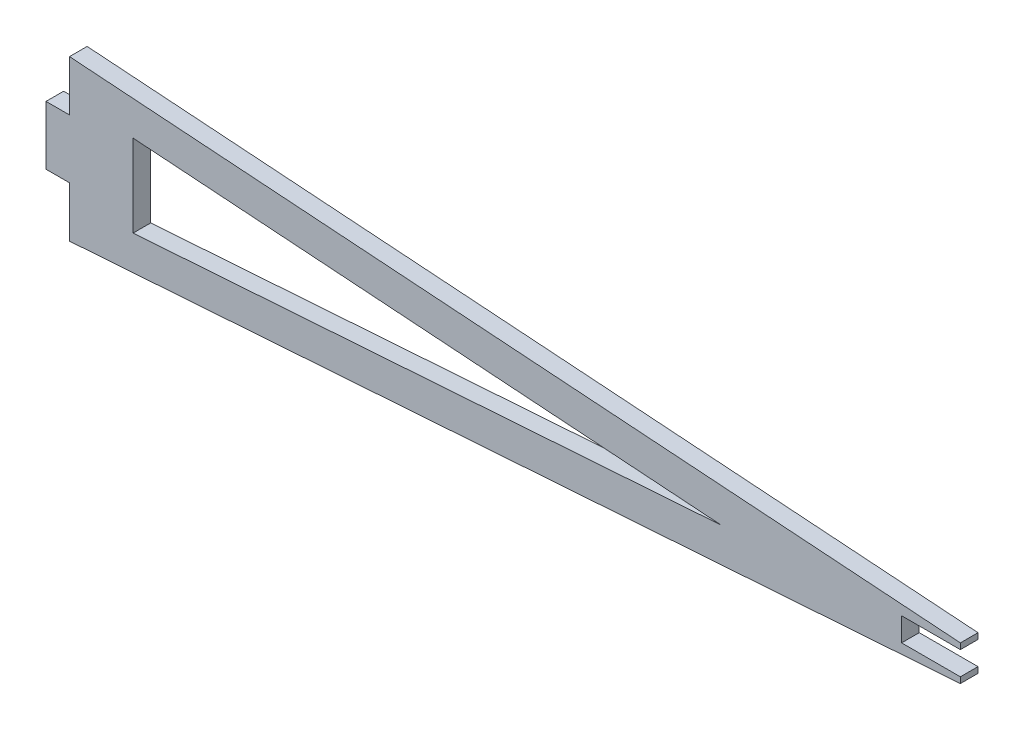
ISO-10303-21;
HEADER;
FILE_DESCRIPTION(('STEP AP214'),'2;1');
FILE_NAME('part.step','',(''),(''),'','','');
FILE_SCHEMA(('AUTOMOTIVE_DESIGN { 1 0 10303 214 1 1 1 1 }'));
ENDSEC;
DATA;
#1=APPLICATION_CONTEXT('core data for automotive mechanical design processes');
#2=APPLICATION_PROTOCOL_DEFINITION('international standard','automotive_design',2000,#1);
#3=PRODUCT_CONTEXT('',#1,'mechanical');
#4=PRODUCT('Part','Part','',(#3));
#5=PRODUCT_RELATED_PRODUCT_CATEGORY('part','',(#4));
#6=PRODUCT_DEFINITION_FORMATION('','',#4);
#7=PRODUCT_DEFINITION_CONTEXT('part definition',#1,'design');
#8=PRODUCT_DEFINITION('design','',#6,#7);
#9=PRODUCT_DEFINITION_SHAPE('','',#8);
#10=(LENGTH_UNIT() NAMED_UNIT(*) SI_UNIT(.MILLI.,.METRE.));
#11=(NAMED_UNIT(*) PLANE_ANGLE_UNIT() SI_UNIT($,.RADIAN.));
#12=(NAMED_UNIT(*) SI_UNIT($,.STERADIAN.) SOLID_ANGLE_UNIT());
#13=UNCERTAINTY_MEASURE_WITH_UNIT(LENGTH_MEASURE(1.E-05),#10,'distance_accuracy_value','');
#14=(GEOMETRIC_REPRESENTATION_CONTEXT(3) GLOBAL_UNCERTAINTY_ASSIGNED_CONTEXT((#13)) GLOBAL_UNIT_ASSIGNED_CONTEXT((#10,
#11,#12)) REPRESENTATION_CONTEXT('',''));
#15=CARTESIAN_POINT('',(0.,0.,0.));
#16=DIRECTION('',(0.,0.,1.));
#17=DIRECTION('',(1.,0.,0.));
#18=AXIS2_PLACEMENT_3D('',#15,#16,#17);
#19=CARTESIAN_POINT('',(0.,0.,1.5));
#20=DIRECTION('',(0.,0.,1.));
#21=DIRECTION('',(1.,0.,0.));
#22=AXIS2_PLACEMENT_3D('',#19,#20,#21);
#23=PLANE('',#22);
#24=DIRECTION('',(0.,-1.,0.));
#25=VECTOR('',#24,1.);
#26=CARTESIAN_POINT('',(18.4411857587607,17.0010493646583,1.5));
#27=LINE('',#26,#25);
#28=CARTESIAN_POINT('',(18.4411857587607,17.0010493646583,1.5));
#29=VERTEX_POINT('',#28);
#30=CARTESIAN_POINT('',(18.4411857587607,12.0010493646583,1.5));
#31=VERTEX_POINT('',#30);
#32=EDGE_CURVE('E167',#29,#31,#27,.T.);
#33=ORIENTED_EDGE('',*,*,#32,.T.);
#34=DIRECTION('',(1.,0.,0.));
#35=VECTOR('',#34,1.);
#36=CARTESIAN_POINT('',(18.4411857587607,12.0010493646583,1.5));
#37=LINE('',#36,#35);
#38=CARTESIAN_POINT('',(20.4418760095019,12.0010493646583,1.5));
#39=VERTEX_POINT('',#38);
#40=EDGE_CURVE('E170',#31,#39,#37,.T.);
#41=ORIENTED_EDGE('',*,*,#40,.T.);
#42=DIRECTION('',(0.,-1.,0.));
#43=VECTOR('',#42,1.);
#44=CARTESIAN_POINT('',(20.4418760095019,7.70104936465812,1.5));
#45=LINE('',#44,#43);
#46=CARTESIAN_POINT('',(20.4418760095019,7.70104936465812,1.5));
#47=VERTEX_POINT('',#46);
#48=EDGE_CURVE('E173',#39,#47,#45,.T.);
#49=ORIENTED_EDGE('',*,*,#48,.T.);
#50=DIRECTION('',(0.997564050259824,0.0697564737441267,0.));
#51=VECTOR('',#50,1.);
#52=CARTESIAN_POINT('',(20.4418760095019,7.70104936465812,1.5));
#53=LINE('',#52,#51);
#54=CARTESIAN_POINT('',(96.2354071700762,13.0010493646583,1.5));
#55=VERTEX_POINT('',#54);
#56=EDGE_CURVE('E175',#47,#55,#53,.T.);
#57=ORIENTED_EDGE('',*,*,#56,.T.);
#58=DIRECTION('',(0.,1.,0.));
#59=VECTOR('',#58,1.);
#60=CARTESIAN_POINT('',(96.2354071700762,13.0010493646583,1.5));
#61=LINE('',#60,#59);
#62=CARTESIAN_POINT('',(96.2354071700762,13.5010493646583,1.5));
#63=VERTEX_POINT('',#62);
#64=EDGE_CURVE('E177',#55,#63,#61,.T.);
#65=ORIENTED_EDGE('',*,*,#64,.T.);
#66=DIRECTION('',(-1.,0.,0.));
#67=VECTOR('',#66,1.);
#68=CARTESIAN_POINT('',(96.2354071700762,13.5010493646583,1.5));
#69=LINE('',#68,#67);
#70=CARTESIAN_POINT('',(91.2354071700762,13.5010493646583,1.5));
#71=VERTEX_POINT('',#70);
#72=EDGE_CURVE('E179',#63,#71,#69,.T.);
#73=ORIENTED_EDGE('',*,*,#72,.T.);
#74=DIRECTION('',(0.,1.,0.));
#75=VECTOR('',#74,1.);
#76=CARTESIAN_POINT('',(91.2354071700762,15.5010493646583,1.5));
#77=LINE('',#76,#75);
#78=CARTESIAN_POINT('',(91.2354071700762,15.5010493646583,1.5));
#79=VERTEX_POINT('',#78);
#80=EDGE_CURVE('E181',#71,#79,#77,.T.);
#81=ORIENTED_EDGE('',*,*,#80,.T.);
#82=DIRECTION('',(1.,0.,0.));
#83=VECTOR('',#82,1.);
#84=CARTESIAN_POINT('',(96.2354067739421,15.5010493646583,1.5));
#85=LINE('',#84,#83);
#86=CARTESIAN_POINT('',(96.2354067739421,15.5010493646583,1.5));
#87=VERTEX_POINT('',#86);
#88=EDGE_CURVE('E183',#79,#87,#85,.T.);
#89=ORIENTED_EDGE('',*,*,#88,.T.);
#90=DIRECTION('',(-7.92266280358087E-07,0.999999999999686,0.));
#91=VECTOR('',#90,1.);
#92=CARTESIAN_POINT('',(96.2354067739421,15.5010493646583,1.5));
#93=LINE('',#92,#91);
#94=CARTESIAN_POINT('',(96.235406377809,16.0010493646583,1.5));
#95=VERTEX_POINT('',#94);
#96=EDGE_CURVE('E185',#87,#95,#93,.T.);
#97=ORIENTED_EDGE('',*,*,#96,.T.);
#98=DIRECTION('',(-0.997564050259825,0.0697564737441117,0.));
#99=VECTOR('',#98,1.);
#100=CARTESIAN_POINT('',(20.4418760095019,21.3010493092566,1.5));
#101=LINE('',#100,#99);
#102=CARTESIAN_POINT('',(20.4418760095019,21.3010493092566,1.5));
#103=VERTEX_POINT('',#102);
#104=EDGE_CURVE('E187',#95,#103,#101,.T.);
#105=ORIENTED_EDGE('',*,*,#104,.T.);
#106=DIRECTION('',(-0.000160523428179569,-0.999999987116114,0.));
#107=VECTOR('',#106,1.);
#108=CARTESIAN_POINT('',(20.4411857587607,17.0010493646583,1.5));
#109=LINE('',#108,#107);
#110=CARTESIAN_POINT('',(20.4411857587607,17.0010493646583,1.5));
#111=VERTEX_POINT('',#110);
#112=EDGE_CURVE('E189',#103,#111,#109,.T.);
#113=ORIENTED_EDGE('',*,*,#112,.T.);
#114=DIRECTION('',(-1.,0.,0.));
#115=VECTOR('',#114,1.);
#116=CARTESIAN_POINT('',(20.4411857587607,17.0010493646583,1.5));
#117=LINE('',#116,#115);
#118=EDGE_CURVE('E191',#111,#29,#117,.T.);
#119=ORIENTED_EDGE('',*,*,#118,.T.);
#120=EDGE_LOOP('',(#33,#41,#49,#57,#65,#73,#81,#89,#97,#105,#113,#119));
#121=FACE_BOUND('',#120,.T.);
#122=DIRECTION('',(-0.997564050259824,0.0697564737441269,0.));
#123=VECTOR('',#122,1.);
#124=CARTESIAN_POINT('',(25.8506130736974,18.0010493646583,1.5));
#125=LINE('',#124,#123);
#126=CARTESIAN_POINT('',(75.902944972188,14.5010493646583,1.5));
#127=VERTEX_POINT('',#126);
#128=CARTESIAN_POINT('',(25.8506130736974,18.0010493646583,1.5));
#129=VERTEX_POINT('',#128);
#130=EDGE_CURVE('E148',#127,#129,#125,.T.);
#131=ORIENTED_EDGE('',*,*,#130,.F.);
#132=DIRECTION('',(0.997564050259824,0.0697564737441269,0.));
#133=VECTOR('',#132,1.);
#134=CARTESIAN_POINT('',(25.8506130736974,11.0010493646583,1.5));
#135=LINE('',#134,#133);
#136=CARTESIAN_POINT('',(25.8506130736974,11.0010493646583,1.5));
#137=VERTEX_POINT('',#136);
#138=EDGE_CURVE('E140',#137,#127,#135,.T.);
#139=ORIENTED_EDGE('',*,*,#138,.F.);
#140=DIRECTION('',(0.,-1.,0.));
#141=VECTOR('',#140,1.);
#142=CARTESIAN_POINT('',(25.8506130736974,11.0010493646583,1.5));
#143=LINE('',#142,#141);
#144=EDGE_CURVE('E157',#129,#137,#143,.T.);
#145=ORIENTED_EDGE('',*,*,#144,.F.);
#146=EDGE_LOOP('',(#131,#139,#145));
#147=FACE_BOUND('',#146,.T.);
#148=ADVANCED_FACE('F33',(#121,#147),#23,.T.);
#149=CARTESIAN_POINT('',(0.,0.,0.));
#150=DIRECTION('',(0.,0.,1.));
#151=DIRECTION('',(1.,0.,0.));
#152=AXIS2_PLACEMENT_3D('',#149,#150,#151);
#153=PLANE('',#152);
#154=DIRECTION('',(0.,-1.,0.));
#155=VECTOR('',#154,1.);
#156=CARTESIAN_POINT('',(18.4411857587607,17.0010493646583,0.));
#157=LINE('',#156,#155);
#158=CARTESIAN_POINT('',(18.4411857587607,17.0010493646583,0.));
#159=VERTEX_POINT('',#158);
#160=CARTESIAN_POINT('',(18.4411857587607,12.0010493646583,0.));
#161=VERTEX_POINT('',#160);
#162=EDGE_CURVE('E155',#159,#161,#157,.T.);
#163=ORIENTED_EDGE('',*,*,#162,.F.);
#164=DIRECTION('',(-1.,0.,0.));
#165=VECTOR('',#164,1.);
#166=CARTESIAN_POINT('',(20.4411857587607,17.0010493646583,0.));
#167=LINE('',#166,#165);
#168=CARTESIAN_POINT('',(20.4411857587607,17.0010493646583,0.));
#169=VERTEX_POINT('',#168);
#170=EDGE_CURVE('E171',#169,#159,#167,.T.);
#171=ORIENTED_EDGE('',*,*,#170,.F.);
#172=DIRECTION('',(-0.000160523428179569,-0.999999987116114,0.));
#173=VECTOR('',#172,1.);
#174=CARTESIAN_POINT('',(20.4411857587607,17.0010493646583,0.));
#175=LINE('',#174,#173);
#176=CARTESIAN_POINT('',(20.4418760095019,21.3010493092566,0.));
#177=VERTEX_POINT('',#176);
#178=EDGE_CURVE('E214',#177,#169,#175,.T.);
#179=ORIENTED_EDGE('',*,*,#178,.F.);
#180=DIRECTION('',(-0.997564050259825,0.0697564737441117,0.));
#181=VECTOR('',#180,1.);
#182=CARTESIAN_POINT('',(20.4418760095019,21.3010493092566,0.));
#183=LINE('',#182,#181);
#184=CARTESIAN_POINT('',(96.235406377809,16.0010493646583,0.));
#185=VERTEX_POINT('',#184);
#186=EDGE_CURVE('E212',#185,#177,#183,.T.);
#187=ORIENTED_EDGE('',*,*,#186,.F.);
#188=DIRECTION('',(-7.92266280358087E-07,0.999999999999686,0.));
#189=VECTOR('',#188,1.);
#190=CARTESIAN_POINT('',(96.2354067739421,15.5010493646583,0.));
#191=LINE('',#190,#189);
#192=CARTESIAN_POINT('',(96.2354067739421,15.5010493646583,0.));
#193=VERTEX_POINT('',#192);
#194=EDGE_CURVE('E210',#193,#185,#191,.T.);
#195=ORIENTED_EDGE('',*,*,#194,.F.);
#196=DIRECTION('',(1.,0.,0.));
#197=VECTOR('',#196,1.);
#198=CARTESIAN_POINT('',(96.2354067739421,15.5010493646583,0.));
#199=LINE('',#198,#197);
#200=CARTESIAN_POINT('',(91.2354071700762,15.5010493646583,0.));
#201=VERTEX_POINT('',#200);
#202=EDGE_CURVE('E208',#201,#193,#199,.T.);
#203=ORIENTED_EDGE('',*,*,#202,.F.);
#204=DIRECTION('',(0.,1.,0.));
#205=VECTOR('',#204,1.);
#206=CARTESIAN_POINT('',(91.2354071700762,15.5010493646583,0.));
#207=LINE('',#206,#205);
#208=CARTESIAN_POINT('',(91.2354071700762,13.5010493646583,0.));
#209=VERTEX_POINT('',#208);
#210=EDGE_CURVE('E206',#209,#201,#207,.T.);
#211=ORIENTED_EDGE('',*,*,#210,.F.);
#212=DIRECTION('',(-1.,0.,0.));
#213=VECTOR('',#212,1.);
#214=CARTESIAN_POINT('',(96.2354071700762,13.5010493646583,0.));
#215=LINE('',#214,#213);
#216=CARTESIAN_POINT('',(96.2354071700762,13.5010493646583,0.));
#217=VERTEX_POINT('',#216);
#218=EDGE_CURVE('E204',#217,#209,#215,.T.);
#219=ORIENTED_EDGE('',*,*,#218,.F.);
#220=DIRECTION('',(0.,1.,0.));
#221=VECTOR('',#220,1.);
#222=CARTESIAN_POINT('',(96.2354071700762,13.0010493646583,0.));
#223=LINE('',#222,#221);
#224=CARTESIAN_POINT('',(96.2354071700762,13.0010493646583,0.));
#225=VERTEX_POINT('',#224);
#226=EDGE_CURVE('E202',#225,#217,#223,.T.);
#227=ORIENTED_EDGE('',*,*,#226,.F.);
#228=DIRECTION('',(0.997564050259824,0.0697564737441267,0.));
#229=VECTOR('',#228,1.);
#230=CARTESIAN_POINT('',(20.4418760095019,7.70104936465812,0.));
#231=LINE('',#230,#229);
#232=CARTESIAN_POINT('',(20.4418760095019,7.70104936465812,0.));
#233=VERTEX_POINT('',#232);
#234=EDGE_CURVE('E200',#233,#225,#231,.T.);
#235=ORIENTED_EDGE('',*,*,#234,.F.);
#236=DIRECTION('',(0.,-1.,0.));
#237=VECTOR('',#236,1.);
#238=CARTESIAN_POINT('',(20.4418760095019,7.70104936465812,0.));
#239=LINE('',#238,#237);
#240=CARTESIAN_POINT('',(20.4418760095019,12.0010493646583,0.));
#241=VERTEX_POINT('',#240);
#242=EDGE_CURVE('E198',#241,#233,#239,.T.);
#243=ORIENTED_EDGE('',*,*,#242,.F.);
#244=DIRECTION('',(1.,0.,0.));
#245=VECTOR('',#244,1.);
#246=CARTESIAN_POINT('',(18.4411857587607,12.0010493646583,0.));
#247=LINE('',#246,#245);
#248=EDGE_CURVE('E196',#161,#241,#247,.T.);
#249=ORIENTED_EDGE('',*,*,#248,.F.);
#250=EDGE_LOOP('',(#163,#171,#179,#187,#195,#203,#211,#219,#227,#235,#243,#249));
#251=FACE_BOUND('',#250,.T.);
#252=DIRECTION('',(0.997564050259824,0.0697564737441269,0.));
#253=VECTOR('',#252,1.);
#254=CARTESIAN_POINT('',(25.8506130736974,11.0010493646583,0.));
#255=LINE('',#254,#253);
#256=CARTESIAN_POINT('',(25.8506130736974,11.0010493646583,0.));
#257=VERTEX_POINT('',#256);
#258=CARTESIAN_POINT('',(75.902944972188,14.5010493646583,0.));
#259=VERTEX_POINT('',#258);
#260=EDGE_CURVE('E56',#257,#259,#255,.T.);
#261=ORIENTED_EDGE('',*,*,#260,.T.);
#262=DIRECTION('',(-0.997564050259824,0.0697564737441269,0.));
#263=VECTOR('',#262,1.);
#264=CARTESIAN_POINT('',(25.8506130736974,18.0010493646583,0.));
#265=LINE('',#264,#263);
#266=CARTESIAN_POINT('',(25.8506130736974,18.0010493646583,0.));
#267=VERTEX_POINT('',#266);
#268=EDGE_CURVE('E154',#259,#267,#265,.T.);
#269=ORIENTED_EDGE('',*,*,#268,.T.);
#270=DIRECTION('',(0.,-1.,0.));
#271=VECTOR('',#270,1.);
#272=CARTESIAN_POINT('',(25.8506130736974,11.0010493646583,0.));
#273=LINE('',#272,#271);
#274=EDGE_CURVE('E149',#267,#257,#273,.T.);
#275=ORIENTED_EDGE('',*,*,#274,.T.);
#276=EDGE_LOOP('',(#261,#269,#275));
#277=FACE_BOUND('',#276,.T.);
#278=ADVANCED_FACE('F256',(#251,#277),#153,.F.);
#279=CARTESIAN_POINT('',(18.4411857587607,17.0010493646583,1.5));
#280=DIRECTION('',(1.,0.,0.));
#281=DIRECTION('',(0.,0.,-1.));
#282=AXIS2_PLACEMENT_3D('',#279,#280,#281);
#283=PLANE('',#282);
#284=ORIENTED_EDGE('',*,*,#162,.T.);
#285=DIRECTION('',(0.,0.,-1.));
#286=VECTOR('',#285,1.);
#287=CARTESIAN_POINT('',(18.4411857587607,12.0010493646583,1.5));
#288=LINE('',#287,#286);
#289=EDGE_CURVE('E11',#31,#161,#288,.T.);
#290=ORIENTED_EDGE('',*,*,#289,.F.);
#291=ORIENTED_EDGE('',*,*,#32,.F.);
#292=DIRECTION('',(0.,0.,-1.));
#293=VECTOR('',#292,1.);
#294=CARTESIAN_POINT('',(18.4411857587607,17.0010493646583,1.5));
#295=LINE('',#294,#293);
#296=EDGE_CURVE('E193',#29,#159,#295,.T.);
#297=ORIENTED_EDGE('',*,*,#296,.T.);
#298=EDGE_LOOP('',(#284,#290,#291,#297));
#299=FACE_BOUND('',#298,.T.);
#300=ADVANCED_FACE('F35',(#299),#283,.F.);
#301=CARTESIAN_POINT('',(18.4411857587607,12.0010493646583,1.5));
#302=DIRECTION('',(0.,1.,0.));
#303=DIRECTION('',(0.,0.,1.));
#304=AXIS2_PLACEMENT_3D('',#301,#302,#303);
#305=PLANE('',#304);
#306=ORIENTED_EDGE('',*,*,#248,.T.);
#307=DIRECTION('',(0.,0.,-1.));
#308=VECTOR('',#307,1.);
#309=CARTESIAN_POINT('',(20.4418760095019,12.0010493646583,1.5));
#310=LINE('',#309,#308);
#311=EDGE_CURVE('E41',#39,#241,#310,.T.);
#312=ORIENTED_EDGE('',*,*,#311,.F.);
#313=ORIENTED_EDGE('',*,*,#40,.F.);
#314=ORIENTED_EDGE('',*,*,#289,.T.);
#315=EDGE_LOOP('',(#306,#312,#313,#314));
#316=FACE_BOUND('',#315,.T.);
#317=ADVANCED_FACE('F273',(#316),#305,.F.);
#318=CARTESIAN_POINT('',(20.4418760095019,7.70104936465812,1.5));
#319=DIRECTION('',(1.,0.,0.));
#320=DIRECTION('',(0.,0.,-1.));
#321=AXIS2_PLACEMENT_3D('',#318,#319,#320);
#322=PLANE('',#321);
#323=ORIENTED_EDGE('',*,*,#242,.T.);
#324=DIRECTION('',(0.,0.,-1.));
#325=VECTOR('',#324,1.);
#326=CARTESIAN_POINT('',(20.4418760095019,7.70104936465812,1.5));
#327=LINE('',#326,#325);
#328=EDGE_CURVE('E243',#47,#233,#327,.T.);
#329=ORIENTED_EDGE('',*,*,#328,.F.);
#330=ORIENTED_EDGE('',*,*,#48,.F.);
#331=ORIENTED_EDGE('',*,*,#311,.T.);
#332=EDGE_LOOP('',(#323,#329,#330,#331));
#333=FACE_BOUND('',#332,.T.);
#334=ADVANCED_FACE('F250',(#333),#322,.F.);
#335=CARTESIAN_POINT('',(20.4418760095019,7.70104936465812,1.5));
#336=DIRECTION('',(-0.0697564737441267,0.997564050259824,0.));
#337=DIRECTION('',(-0.997564050259824,-0.0697564737441267,0.));
#338=AXIS2_PLACEMENT_3D('',#335,#336,#337);
#339=PLANE('',#338);
#340=ORIENTED_EDGE('',*,*,#234,.T.);
#341=DIRECTION('',(0.,0.,-1.));
#342=VECTOR('',#341,1.);
#343=CARTESIAN_POINT('',(96.2354071700762,13.0010493646583,1.5));
#344=LINE('',#343,#342);
#345=EDGE_CURVE('E240',#55,#225,#344,.T.);
#346=ORIENTED_EDGE('',*,*,#345,.F.);
#347=ORIENTED_EDGE('',*,*,#56,.F.);
#348=ORIENTED_EDGE('',*,*,#328,.T.);
#349=EDGE_LOOP('',(#340,#346,#347,#348));
#350=FACE_BOUND('',#349,.T.);
#351=ADVANCED_FACE('F262',(#350),#339,.F.);
#352=CARTESIAN_POINT('',(96.2354071700762,13.0010493646583,1.5));
#353=DIRECTION('',(-1.,0.,0.));
#354=DIRECTION('',(0.,0.,1.));
#355=AXIS2_PLACEMENT_3D('',#352,#353,#354);
#356=PLANE('',#355);
#357=ORIENTED_EDGE('',*,*,#226,.T.);
#358=DIRECTION('',(0.,0.,-1.));
#359=VECTOR('',#358,1.);
#360=CARTESIAN_POINT('',(96.2354071700762,13.5010493646583,1.5));
#361=LINE('',#360,#359);
#362=EDGE_CURVE('E237',#63,#217,#361,.T.);
#363=ORIENTED_EDGE('',*,*,#362,.F.);
#364=ORIENTED_EDGE('',*,*,#64,.F.);
#365=ORIENTED_EDGE('',*,*,#345,.T.);
#366=EDGE_LOOP('',(#357,#363,#364,#365));
#367=FACE_BOUND('',#366,.T.);
#368=ADVANCED_FACE('F266',(#367),#356,.F.);
#369=CARTESIAN_POINT('',(96.2354071700762,13.5010493646583,1.5));
#370=DIRECTION('',(0.,-1.,0.));
#371=DIRECTION('',(0.,0.,-1.));
#372=AXIS2_PLACEMENT_3D('',#369,#370,#371);
#373=PLANE('',#372);
#374=ORIENTED_EDGE('',*,*,#218,.T.);
#375=DIRECTION('',(0.,0.,-1.));
#376=VECTOR('',#375,1.);
#377=CARTESIAN_POINT('',(91.2354071700762,13.5010493646583,1.5));
#378=LINE('',#377,#376);
#379=EDGE_CURVE('E234',#71,#209,#378,.T.);
#380=ORIENTED_EDGE('',*,*,#379,.F.);
#381=ORIENTED_EDGE('',*,*,#72,.F.);
#382=ORIENTED_EDGE('',*,*,#362,.T.);
#383=EDGE_LOOP('',(#374,#380,#381,#382));
#384=FACE_BOUND('',#383,.T.);
#385=ADVANCED_FACE('F306',(#384),#373,.F.);
#386=CARTESIAN_POINT('',(91.2354071700762,15.5010493646583,1.5));
#387=DIRECTION('',(-1.,0.,0.));
#388=DIRECTION('',(0.,0.,1.));
#389=AXIS2_PLACEMENT_3D('',#386,#387,#388);
#390=PLANE('',#389);
#391=ORIENTED_EDGE('',*,*,#210,.T.);
#392=DIRECTION('',(0.,0.,-1.));
#393=VECTOR('',#392,1.);
#394=CARTESIAN_POINT('',(91.2354071700762,15.5010493646583,1.5));
#395=LINE('',#394,#393);
#396=EDGE_CURVE('E231',#79,#201,#395,.T.);
#397=ORIENTED_EDGE('',*,*,#396,.F.);
#398=ORIENTED_EDGE('',*,*,#80,.F.);
#399=ORIENTED_EDGE('',*,*,#379,.T.);
#400=EDGE_LOOP('',(#391,#397,#398,#399));
#401=FACE_BOUND('',#400,.T.);
#402=ADVANCED_FACE('F304',(#401),#390,.F.);
#403=CARTESIAN_POINT('',(96.2354067739421,15.5010493646583,1.5));
#404=DIRECTION('',(0.,1.,0.));
#405=DIRECTION('',(0.,0.,1.));
#406=AXIS2_PLACEMENT_3D('',#403,#404,#405);
#407=PLANE('',#406);
#408=ORIENTED_EDGE('',*,*,#202,.T.);
#409=DIRECTION('',(0.,0.,-1.));
#410=VECTOR('',#409,1.);
#411=CARTESIAN_POINT('',(96.2354067739421,15.5010493646583,1.5));
#412=LINE('',#411,#410);
#413=EDGE_CURVE('E228',#87,#193,#412,.T.);
#414=ORIENTED_EDGE('',*,*,#413,.F.);
#415=ORIENTED_EDGE('',*,*,#88,.F.);
#416=ORIENTED_EDGE('',*,*,#396,.T.);
#417=EDGE_LOOP('',(#408,#414,#415,#416));
#418=FACE_BOUND('',#417,.T.);
#419=ADVANCED_FACE('F300',(#418),#407,.F.);
#420=CARTESIAN_POINT('',(96.2354067739421,15.5010493646583,1.5));
#421=DIRECTION('',(-0.999999999999686,-7.92266280358087E-07,0.));
#422=DIRECTION('',(7.92266280358087E-07,-0.999999999999686,0.));
#423=AXIS2_PLACEMENT_3D('',#420,#421,#422);
#424=PLANE('',#423);
#425=ORIENTED_EDGE('',*,*,#194,.T.);
#426=DIRECTION('',(0.,0.,-1.));
#427=VECTOR('',#426,1.);
#428=CARTESIAN_POINT('',(96.235406377809,16.0010493646583,1.5));
#429=LINE('',#428,#427);
#430=EDGE_CURVE('E225',#95,#185,#429,.T.);
#431=ORIENTED_EDGE('',*,*,#430,.F.);
#432=ORIENTED_EDGE('',*,*,#96,.F.);
#433=ORIENTED_EDGE('',*,*,#413,.T.);
#434=EDGE_LOOP('',(#425,#431,#432,#433));
#435=FACE_BOUND('',#434,.T.);
#436=ADVANCED_FACE('F295',(#435),#424,.F.);
#437=CARTESIAN_POINT('',(20.4418760095019,21.3010493092566,1.5));
#438=DIRECTION('',(-0.0697564737441116,-0.997564050259825,0.));
#439=DIRECTION('',(0.997564050259825,-0.0697564737441117,0.));
#440=AXIS2_PLACEMENT_3D('',#437,#438,#439);
#441=PLANE('',#440);
#442=ORIENTED_EDGE('',*,*,#186,.T.);
#443=DIRECTION('',(0.,0.,-1.));
#444=VECTOR('',#443,1.);
#445=CARTESIAN_POINT('',(20.4418760095019,21.3010493092566,1.5));
#446=LINE('',#445,#444);
#447=EDGE_CURVE('E222',#103,#177,#446,.T.);
#448=ORIENTED_EDGE('',*,*,#447,.F.);
#449=ORIENTED_EDGE('',*,*,#104,.F.);
#450=ORIENTED_EDGE('',*,*,#430,.T.);
#451=EDGE_LOOP('',(#442,#448,#449,#450));
#452=FACE_BOUND('',#451,.T.);
#453=ADVANCED_FACE('F289',(#452),#441,.F.);
#454=CARTESIAN_POINT('',(20.4411857587607,17.0010493646583,1.5));
#455=DIRECTION('',(0.999999987116114,-0.000160523428179569,0.));
#456=DIRECTION('',(0.000160523428179569,0.999999987116114,0.));
#457=AXIS2_PLACEMENT_3D('',#454,#455,#456);
#458=PLANE('',#457);
#459=ORIENTED_EDGE('',*,*,#178,.T.);
#460=DIRECTION('',(0.,0.,-1.));
#461=VECTOR('',#460,1.);
#462=CARTESIAN_POINT('',(20.4411857587607,17.0010493646583,1.5));
#463=LINE('',#462,#461);
#464=EDGE_CURVE('E219',#111,#169,#463,.T.);
#465=ORIENTED_EDGE('',*,*,#464,.F.);
#466=ORIENTED_EDGE('',*,*,#112,.F.);
#467=ORIENTED_EDGE('',*,*,#447,.T.);
#468=EDGE_LOOP('',(#459,#465,#466,#467));
#469=FACE_BOUND('',#468,.T.);
#470=ADVANCED_FACE('F285',(#469),#458,.F.);
#471=CARTESIAN_POINT('',(20.4411857587607,17.0010493646583,1.5));
#472=DIRECTION('',(0.,-1.,0.));
#473=DIRECTION('',(0.,0.,-1.));
#474=AXIS2_PLACEMENT_3D('',#471,#472,#473);
#475=PLANE('',#474);
#476=ORIENTED_EDGE('',*,*,#170,.T.);
#477=ORIENTED_EDGE('',*,*,#296,.F.);
#478=ORIENTED_EDGE('',*,*,#118,.F.);
#479=ORIENTED_EDGE('',*,*,#464,.T.);
#480=EDGE_LOOP('',(#476,#477,#478,#479));
#481=FACE_BOUND('',#480,.T.);
#482=ADVANCED_FACE('F280',(#481),#475,.F.);
#483=CARTESIAN_POINT('',(25.8506130736974,11.0010493646583,1.5));
#484=DIRECTION('',(-0.0697564737441269,0.997564050259824,0.));
#485=DIRECTION('',(-0.997564050259824,-0.0697564737441269,0.));
#486=AXIS2_PLACEMENT_3D('',#483,#484,#485);
#487=PLANE('',#486);
#488=ORIENTED_EDGE('',*,*,#260,.F.);
#489=DIRECTION('',(0.,0.,-1.));
#490=VECTOR('',#489,1.);
#491=CARTESIAN_POINT('',(25.8506130736974,11.0010493646583,1.5));
#492=LINE('',#491,#490);
#493=EDGE_CURVE('E144',#137,#257,#492,.T.);
#494=ORIENTED_EDGE('',*,*,#493,.F.);
#495=ORIENTED_EDGE('',*,*,#138,.T.);
#496=DIRECTION('',(0.,0.,-1.));
#497=VECTOR('',#496,1.);
#498=CARTESIAN_POINT('',(75.902944972188,14.5010493646583,1.5));
#499=LINE('',#498,#497);
#500=EDGE_CURVE('E143',#127,#259,#499,.T.);
#501=ORIENTED_EDGE('',*,*,#500,.T.);
#502=EDGE_LOOP('',(#488,#494,#495,#501));
#503=FACE_BOUND('',#502,.T.);
#504=ADVANCED_FACE('F142',(#503),#487,.T.);
#505=CARTESIAN_POINT('',(25.8506130736974,18.0010493646583,1.5));
#506=DIRECTION('',(-0.0697564737441269,-0.997564050259824,0.));
#507=DIRECTION('',(0.997564050259824,-0.0697564737441269,0.));
#508=AXIS2_PLACEMENT_3D('',#505,#506,#507);
#509=PLANE('',#508);
#510=ORIENTED_EDGE('',*,*,#268,.F.);
#511=ORIENTED_EDGE('',*,*,#500,.F.);
#512=ORIENTED_EDGE('',*,*,#130,.T.);
#513=DIRECTION('',(0.,0.,-1.));
#514=VECTOR('',#513,1.);
#515=CARTESIAN_POINT('',(25.8506130736974,18.0010493646583,1.5));
#516=LINE('',#515,#514);
#517=EDGE_CURVE('E48',#129,#267,#516,.T.);
#518=ORIENTED_EDGE('',*,*,#517,.T.);
#519=EDGE_LOOP('',(#510,#511,#512,#518));
#520=FACE_BOUND('',#519,.T.);
#521=ADVANCED_FACE('F152',(#520),#509,.T.);
#522=CARTESIAN_POINT('',(25.8506130736974,11.0010493646583,1.5));
#523=DIRECTION('',(1.,0.,0.));
#524=DIRECTION('',(0.,0.,-1.));
#525=AXIS2_PLACEMENT_3D('',#522,#523,#524);
#526=PLANE('',#525);
#527=ORIENTED_EDGE('',*,*,#274,.F.);
#528=ORIENTED_EDGE('',*,*,#517,.F.);
#529=ORIENTED_EDGE('',*,*,#144,.T.);
#530=ORIENTED_EDGE('',*,*,#493,.T.);
#531=EDGE_LOOP('',(#527,#528,#529,#530));
#532=FACE_BOUND('',#531,.T.);
#533=ADVANCED_FACE('F364',(#532),#526,.T.);
#534=CLOSED_SHELL('',(#148,#278,#300,#317,#334,#351,#368,#385,#402,#419,#436,#453,#470,#482,
#504,#521,#533));
#535=MANIFOLD_SOLID_BREP('B2',#534);
#536=ADVANCED_BREP_SHAPE_REPRESENTATION('',(#18,#535),#14);
#537=SHAPE_DEFINITION_REPRESENTATION(#9,#536);
ENDSEC;
END-ISO-10303-21;
